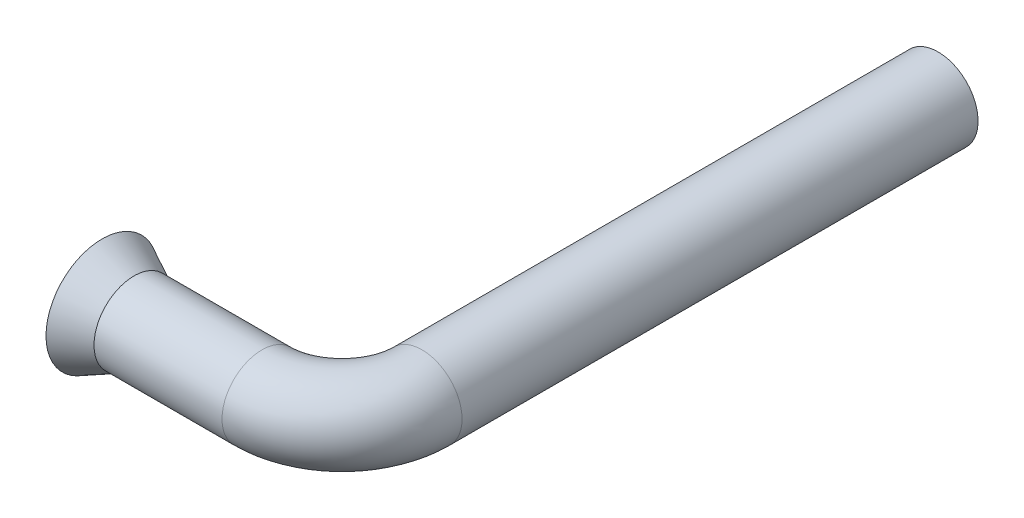
ISO-10303-21;
HEADER;
FILE_DESCRIPTION(('STEP AP214'),'2;1');
FILE_NAME('part.step','',(''),(''),'','','');
FILE_SCHEMA(('AUTOMOTIVE_DESIGN { 1 0 10303 214 1 1 1 1 }'));
ENDSEC;
DATA;
#1=APPLICATION_CONTEXT('core data for automotive mechanical design processes');
#2=APPLICATION_PROTOCOL_DEFINITION('international standard','automotive_design',2000,#1);
#3=PRODUCT_CONTEXT('',#1,'mechanical');
#4=PRODUCT('Part','Part','',(#3));
#5=PRODUCT_RELATED_PRODUCT_CATEGORY('part','',(#4));
#6=PRODUCT_DEFINITION_FORMATION('','',#4);
#7=PRODUCT_DEFINITION_CONTEXT('part definition',#1,'design');
#8=PRODUCT_DEFINITION('design','',#6,#7);
#9=PRODUCT_DEFINITION_SHAPE('','',#8);
#10=(LENGTH_UNIT() NAMED_UNIT(*) SI_UNIT(.MILLI.,.METRE.));
#11=(NAMED_UNIT(*) PLANE_ANGLE_UNIT() SI_UNIT($,.RADIAN.));
#12=(NAMED_UNIT(*) SI_UNIT($,.STERADIAN.) SOLID_ANGLE_UNIT());
#13=UNCERTAINTY_MEASURE_WITH_UNIT(LENGTH_MEASURE(1.E-05),#10,'distance_accuracy_value','');
#14=(GEOMETRIC_REPRESENTATION_CONTEXT(3) GLOBAL_UNCERTAINTY_ASSIGNED_CONTEXT((#13)) GLOBAL_UNIT_ASSIGNED_CONTEXT((#10,
#11,#12)) REPRESENTATION_CONTEXT('',''));
#15=CARTESIAN_POINT('',(0.,0.,0.));
#16=DIRECTION('',(0.,0.,1.));
#17=DIRECTION('',(1.,0.,0.));
#18=AXIS2_PLACEMENT_3D('',#15,#16,#17);
#19=CARTESIAN_POINT('',(0.,0.,0.));
#20=DIRECTION('',(1.,0.,0.));
#21=DIRECTION('',(0.,0.,-1.));
#22=AXIS2_PLACEMENT_3D('',#19,#20,#21);
#23=CYLINDRICAL_SURFACE('',#22,5.);
#24=CARTESIAN_POINT('',(19.9999999999999,0.,0.));
#25=DIRECTION('',(1.,0.,0.));
#26=DIRECTION('',(0.,0.,-1.));
#27=AXIS2_PLACEMENT_3D('',#24,#25,#26);
#28=CIRCLE('',#27,5.);
#29=CARTESIAN_POINT('',(19.9999999999999,0.,5.));
#30=VERTEX_POINT('',#29);
#31=EDGE_CURVE('E71',#30,#30,#28,.T.);
#32=ORIENTED_EDGE('',*,*,#31,.F.);
#33=EDGE_LOOP('',(#32));
#34=FACE_BOUND('',#33,.T.);
#35=CARTESIAN_POINT('',(4.,0.,0.));
#36=DIRECTION('',(-1.,0.,0.));
#37=DIRECTION('',(0.,0.,1.));
#38=AXIS2_PLACEMENT_3D('',#35,#36,#37);
#39=CIRCLE('',#38,5.);
#40=CARTESIAN_POINT('',(4.,0.,5.));
#41=VERTEX_POINT('',#40);
#42=EDGE_CURVE('E78',#41,#41,#39,.T.);
#43=ORIENTED_EDGE('',*,*,#42,.F.);
#44=EDGE_LOOP('',(#43));
#45=FACE_BOUND('',#44,.T.);
#46=ADVANCED_FACE('F34',(#34,#45),#23,.T.);
#47=CARTESIAN_POINT('',(20.,0.,-10.));
#48=DIRECTION('',(0.,1.,0.));
#49=DIRECTION('',(0.,0.,1.));
#50=AXIS2_PLACEMENT_3D('',#47,#48,#49);
#51=TOROIDAL_SURFACE('',#50,10.,5.);
#52=CARTESIAN_POINT('',(30.,0.,-10.0000000000001));
#53=DIRECTION('',(0.,0.,-1.));
#54=DIRECTION('',(-1.,0.,0.));
#55=AXIS2_PLACEMENT_3D('',#52,#53,#54);
#56=CIRCLE('',#55,5.);
#57=CARTESIAN_POINT('',(35.,0.,-10.0000000000001));
#58=VERTEX_POINT('',#57);
#59=EDGE_CURVE('E38',#58,#58,#56,.T.);
#60=CARTESIAN_POINT('',(20.,0.,-10.));
#61=DIRECTION('',(0.,1.,0.));
#62=DIRECTION('',(0.,0.,1.));
#63=AXIS2_PLACEMENT_3D('',#60,#61,#62);
#64=CIRCLE('',#63,15.);
#65=EDGE_CURVE('',#30,#58,#64,.T.);
#66=ORIENTED_EDGE('',*,*,#31,.T.);
#67=ORIENTED_EDGE('',*,*,#59,.F.);
#68=ORIENTED_EDGE('',*,*,#65,.T.);
#69=ORIENTED_EDGE('',*,*,#65,.F.);
#70=EDGE_LOOP('',(#66,#68,#67,#69));
#71=FACE_BOUND('',#70,.T.);
#72=ADVANCED_FACE('F98',(#71),#51,.T.);
#73=CARTESIAN_POINT('',(30.,0.,-10.0000000000001));
#74=DIRECTION('',(0.,0.,-1.));
#75=DIRECTION('',(-1.,0.,0.));
#76=AXIS2_PLACEMENT_3D('',#73,#74,#75);
#77=CYLINDRICAL_SURFACE('',#76,5.);
#78=CARTESIAN_POINT('',(30.,0.,-74.5));
#79=DIRECTION('',(0.,0.,-1.));
#80=DIRECTION('',(-1.,0.,0.));
#81=AXIS2_PLACEMENT_3D('',#78,#79,#80);
#82=CIRCLE('',#81,5.);
#83=CARTESIAN_POINT('',(25.,0.,-74.5));
#84=VERTEX_POINT('',#83);
#85=EDGE_CURVE('E49',#84,#84,#82,.T.);
#86=ORIENTED_EDGE('',*,*,#85,.F.);
#87=EDGE_LOOP('',(#86));
#88=FACE_BOUND('',#87,.T.);
#89=ORIENTED_EDGE('',*,*,#59,.T.);
#90=EDGE_LOOP('',(#89));
#91=FACE_BOUND('',#90,.T.);
#92=ADVANCED_FACE('F36',(#88,#91),#77,.T.);
#93=CARTESIAN_POINT('',(0.,0.,0.));
#94=DIRECTION('',(1.,0.,0.));
#95=DIRECTION('',(0.,0.,-1.));
#96=AXIS2_PLACEMENT_3D('',#93,#94,#95);
#97=PLANE('',#96);
#98=CARTESIAN_POINT('',(0.,0.,0.));
#99=DIRECTION('',(1.,0.,0.));
#100=DIRECTION('',(0.,0.,-1.));
#101=AXIS2_PLACEMENT_3D('',#98,#99,#100);
#102=CIRCLE('',#101,4.);
#103=CARTESIAN_POINT('',(0.,0.,-4.));
#104=VERTEX_POINT('',#103);
#105=EDGE_CURVE('E67',#104,#104,#102,.F.);
#106=ORIENTED_EDGE('',*,*,#105,.F.);
#107=EDGE_LOOP('',(#106));
#108=FACE_BOUND('',#107,.T.);
#109=CARTESIAN_POINT('',(0.,0.,0.));
#110=DIRECTION('',(-1.,0.,0.));
#111=DIRECTION('',(0.,0.,1.));
#112=AXIS2_PLACEMENT_3D('',#109,#110,#111);
#113=CIRCLE('',#112,6.99999999999997);
#114=CARTESIAN_POINT('',(0.,0.,6.99999999999997));
#115=VERTEX_POINT('',#114);
#116=EDGE_CURVE('E73',#115,#115,#113,.T.);
#117=ORIENTED_EDGE('',*,*,#116,.T.);
#118=EDGE_LOOP('',(#117));
#119=FACE_BOUND('',#118,.T.);
#120=ADVANCED_FACE('F90',(#108,#119),#97,.F.);
#121=CARTESIAN_POINT('',(30.,0.,-74.5));
#122=DIRECTION('',(0.,0.,-1.));
#123=DIRECTION('',(-1.,0.,0.));
#124=AXIS2_PLACEMENT_3D('',#121,#122,#123);
#125=PLANE('',#124);
#126=CARTESIAN_POINT('',(30.,0.,-74.5));
#127=DIRECTION('',(0.,0.,-1.));
#128=DIRECTION('',(-1.,0.,0.));
#129=AXIS2_PLACEMENT_3D('',#126,#127,#128);
#130=CIRCLE('',#129,4.);
#131=CARTESIAN_POINT('',(26.,0.,-74.5));
#132=VERTEX_POINT('',#131);
#133=EDGE_CURVE('E11',#132,#132,#130,.F.);
#134=ORIENTED_EDGE('',*,*,#133,.T.);
#135=EDGE_LOOP('',(#134));
#136=FACE_BOUND('',#135,.T.);
#137=ORIENTED_EDGE('',*,*,#85,.T.);
#138=EDGE_LOOP('',(#137));
#139=FACE_BOUND('',#138,.T.);
#140=ADVANCED_FACE('F52',(#136,#139),#125,.T.);
#141=CARTESIAN_POINT('',(0.,0.,0.));
#142=DIRECTION('',(1.,0.,0.));
#143=DIRECTION('',(0.,0.,-1.));
#144=AXIS2_PLACEMENT_3D('',#141,#142,#143);
#145=CYLINDRICAL_SURFACE('',#144,4.);
#146=ORIENTED_EDGE('',*,*,#105,.T.);
#147=EDGE_LOOP('',(#146));
#148=FACE_BOUND('',#147,.T.);
#149=CARTESIAN_POINT('',(19.9999999999999,0.,0.));
#150=DIRECTION('',(1.,0.,0.));
#151=DIRECTION('',(0.,0.,-1.));
#152=AXIS2_PLACEMENT_3D('',#149,#150,#151);
#153=CIRCLE('',#152,4.);
#154=CARTESIAN_POINT('',(19.9999999999999,0.,4.));
#155=VERTEX_POINT('',#154);
#156=EDGE_CURVE('E64',#155,#155,#153,.F.);
#157=ORIENTED_EDGE('',*,*,#156,.F.);
#158=EDGE_LOOP('',(#157));
#159=FACE_BOUND('',#158,.T.);
#160=ADVANCED_FACE('F87',(#148,#159),#145,.F.);
#161=CARTESIAN_POINT('',(20.,0.,-10.));
#162=DIRECTION('',(0.,1.,0.));
#163=DIRECTION('',(0.,0.,1.));
#164=AXIS2_PLACEMENT_3D('',#161,#162,#163);
#165=TOROIDAL_SURFACE('',#164,10.,4.);
#166=CARTESIAN_POINT('',(30.,0.,-10.0000000000001));
#167=DIRECTION('',(0.,0.,-1.));
#168=DIRECTION('',(-1.,0.,0.));
#169=AXIS2_PLACEMENT_3D('',#166,#167,#168);
#170=CIRCLE('',#169,4.);
#171=CARTESIAN_POINT('',(34.,0.,-10.0000000000001));
#172=VERTEX_POINT('',#171);
#173=EDGE_CURVE('E43',#172,#172,#170,.F.);
#174=CARTESIAN_POINT('',(20.,0.,-10.));
#175=DIRECTION('',(0.,1.,0.));
#176=DIRECTION('',(0.,0.,1.));
#177=AXIS2_PLACEMENT_3D('',#174,#175,#176);
#178=CIRCLE('',#177,14.);
#179=EDGE_CURVE('',#155,#172,#178,.T.);
#180=ORIENTED_EDGE('',*,*,#156,.T.);
#181=ORIENTED_EDGE('',*,*,#173,.F.);
#182=ORIENTED_EDGE('',*,*,#179,.T.);
#183=ORIENTED_EDGE('',*,*,#179,.F.);
#184=EDGE_LOOP('',(#180,#182,#181,#183));
#185=FACE_BOUND('',#184,.T.);
#186=ADVANCED_FACE('F59',(#185),#165,.F.);
#187=CARTESIAN_POINT('',(30.,0.,-10.0000000000001));
#188=DIRECTION('',(0.,0.,-1.));
#189=DIRECTION('',(-1.,0.,0.));
#190=AXIS2_PLACEMENT_3D('',#187,#188,#189);
#191=CYLINDRICAL_SURFACE('',#190,4.);
#192=ORIENTED_EDGE('',*,*,#133,.F.);
#193=EDGE_LOOP('',(#192));
#194=FACE_BOUND('',#193,.T.);
#195=ORIENTED_EDGE('',*,*,#173,.T.);
#196=EDGE_LOOP('',(#195));
#197=FACE_BOUND('',#196,.T.);
#198=ADVANCED_FACE('F55',(#194,#197),#191,.F.);
#199=CARTESIAN_POINT('',(4.,0.,0.));
#200=DIRECTION('',(-1.,0.,0.));
#201=DIRECTION('',(0.,0.,1.));
#202=AXIS2_PLACEMENT_3D('',#199,#200,#201);
#203=CONICAL_SURFACE('',#202,5.,0.463647609000799);
#204=ORIENTED_EDGE('',*,*,#116,.F.);
#205=EDGE_LOOP('',(#204));
#206=FACE_BOUND('',#205,.T.);
#207=ORIENTED_EDGE('',*,*,#42,.T.);
#208=EDGE_LOOP('',(#207));
#209=FACE_BOUND('',#208,.T.);
#210=ADVANCED_FACE('F58',(#206,#209),#203,.T.);
#211=CLOSED_SHELL('',(#46,#72,#92,#120,#140,#160,#186,#198,#210));
#212=MANIFOLD_SOLID_BREP('B2',#211);
#213=ADVANCED_BREP_SHAPE_REPRESENTATION('',(#18,#212),#14);
#214=SHAPE_DEFINITION_REPRESENTATION(#9,#213);
ENDSEC;
END-ISO-10303-21;
